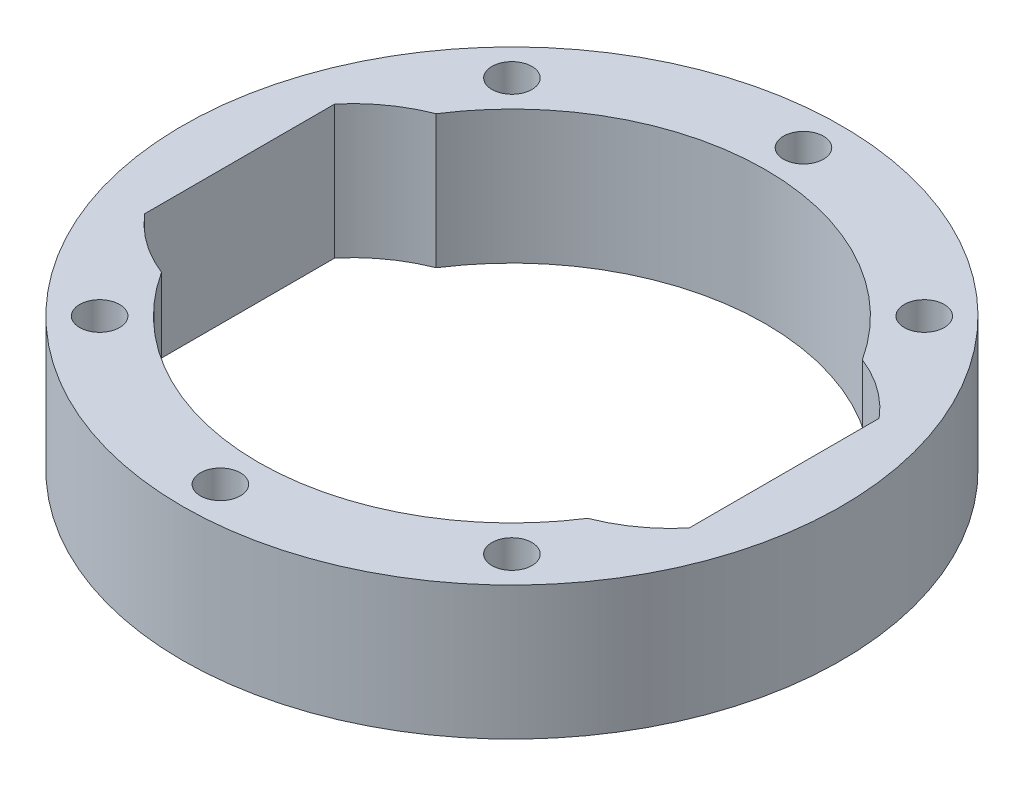
ISO-10303-21;
HEADER;
FILE_DESCRIPTION(('STEP AP214'),'2;1');
FILE_NAME('part.step','',(''),(''),'','','');
FILE_SCHEMA(('AUTOMOTIVE_DESIGN { 1 0 10303 214 1 1 1 1 }'));
ENDSEC;
DATA;
#1=APPLICATION_CONTEXT('core data for automotive mechanical design processes');
#2=APPLICATION_PROTOCOL_DEFINITION('international standard','automotive_design',2000,#1);
#3=PRODUCT_CONTEXT('',#1,'mechanical');
#4=PRODUCT('Part','Part','',(#3));
#5=PRODUCT_RELATED_PRODUCT_CATEGORY('part','',(#4));
#6=PRODUCT_DEFINITION_FORMATION('','',#4);
#7=PRODUCT_DEFINITION_CONTEXT('part definition',#1,'design');
#8=PRODUCT_DEFINITION('design','',#6,#7);
#9=PRODUCT_DEFINITION_SHAPE('','',#8);
#10=(LENGTH_UNIT() NAMED_UNIT(*) SI_UNIT(.MILLI.,.METRE.));
#11=(NAMED_UNIT(*) PLANE_ANGLE_UNIT() SI_UNIT($,.RADIAN.));
#12=(NAMED_UNIT(*) SI_UNIT($,.STERADIAN.) SOLID_ANGLE_UNIT());
#13=UNCERTAINTY_MEASURE_WITH_UNIT(LENGTH_MEASURE(1.E-05),#10,'distance_accuracy_value','');
#14=(GEOMETRIC_REPRESENTATION_CONTEXT(3) GLOBAL_UNCERTAINTY_ASSIGNED_CONTEXT((#13)) GLOBAL_UNIT_ASSIGNED_CONTEXT((#10,
#11,#12)) REPRESENTATION_CONTEXT('',''));
#15=CARTESIAN_POINT('',(0.,0.,0.));
#16=DIRECTION('',(0.,0.,1.));
#17=DIRECTION('',(1.,0.,0.));
#18=AXIS2_PLACEMENT_3D('',#15,#16,#17);
#19=CARTESIAN_POINT('',(0.,20.,0.));
#20=DIRECTION('',(0.,1.,0.));
#21=DIRECTION('',(0.,0.,1.));
#22=AXIS2_PLACEMENT_3D('',#19,#20,#21);
#23=PLANE('',#22);
#24=CARTESIAN_POINT('',(0.,20.,-43.7));
#25=DIRECTION('',(0.,1.,0.));
#26=DIRECTION('',(0.,0.,1.));
#27=AXIS2_PLACEMENT_3D('',#24,#25,#26);
#28=CIRCLE('',#27,3.);
#29=CARTESIAN_POINT('',(0.,20.,-40.7));
#30=VERTEX_POINT('',#29);
#31=EDGE_CURVE('E171',#30,#30,#28,.T.);
#32=ORIENTED_EDGE('',*,*,#31,.F.);
#33=EDGE_LOOP('',(#32));
#34=FACE_BOUND('',#33,.T.);
#35=CARTESIAN_POINT('',(-30.9005663378517,20.,-30.9005663378525));
#36=DIRECTION('',(0.,1.,0.));
#37=DIRECTION('',(0.,0.,1.));
#38=AXIS2_PLACEMENT_3D('',#35,#36,#37);
#39=CIRCLE('',#38,3.);
#40=CARTESIAN_POINT('',(-30.9005663378517,20.,-27.9005663378525));
#41=VERTEX_POINT('',#40);
#42=EDGE_CURVE('E370',#41,#41,#39,.T.);
#43=ORIENTED_EDGE('',*,*,#42,.F.);
#44=EDGE_LOOP('',(#43));
#45=FACE_BOUND('',#44,.T.);
#46=CARTESIAN_POINT('',(-30.9005663378524,20.,30.9005663378519));
#47=DIRECTION('',(0.,1.,0.));
#48=DIRECTION('',(0.,0.,1.));
#49=AXIS2_PLACEMENT_3D('',#46,#47,#48);
#50=CIRCLE('',#49,3.);
#51=CARTESIAN_POINT('',(-30.9005663378524,20.,33.9005663378519));
#52=VERTEX_POINT('',#51);
#53=EDGE_CURVE('E369',#52,#52,#50,.T.);
#54=ORIENTED_EDGE('',*,*,#53,.F.);
#55=EDGE_LOOP('',(#54));
#56=FACE_BOUND('',#55,.T.);
#57=CARTESIAN_POINT('',(-3.0515546901489E-13,20.,43.7));
#58=DIRECTION('',(0.,1.,0.));
#59=DIRECTION('',(0.,0.,1.));
#60=AXIS2_PLACEMENT_3D('',#57,#58,#59);
#61=CIRCLE('',#60,3.);
#62=CARTESIAN_POINT('',(-3.0515546901489E-13,20.,46.7));
#63=VERTEX_POINT('',#62);
#64=EDGE_CURVE('E384',#63,#63,#61,.T.);
#65=ORIENTED_EDGE('',*,*,#64,.F.);
#66=EDGE_LOOP('',(#65));
#67=FACE_BOUND('',#66,.T.);
#68=CARTESIAN_POINT('',(30.900566337852,20.,30.9005663378523));
#69=DIRECTION('',(0.,1.,0.));
#70=DIRECTION('',(0.,0.,1.));
#71=AXIS2_PLACEMENT_3D('',#68,#69,#70);
#72=CIRCLE('',#71,3.);
#73=CARTESIAN_POINT('',(30.900566337852,20.,33.9005663378523));
#74=VERTEX_POINT('',#73);
#75=EDGE_CURVE('E378',#74,#74,#72,.T.);
#76=ORIENTED_EDGE('',*,*,#75,.F.);
#77=EDGE_LOOP('',(#76));
#78=FACE_BOUND('',#77,.T.);
#79=CARTESIAN_POINT('',(30.9005663378522,20.,-30.9005663378521));
#80=DIRECTION('',(0.,1.,0.));
#81=DIRECTION('',(0.,0.,1.));
#82=AXIS2_PLACEMENT_3D('',#79,#80,#81);
#83=CIRCLE('',#82,3.);
#84=CARTESIAN_POINT('',(30.9005663378522,20.,-27.9005663378521));
#85=VERTEX_POINT('',#84);
#86=EDGE_CURVE('E363',#85,#85,#83,.T.);
#87=ORIENTED_EDGE('',*,*,#86,.F.);
#88=EDGE_LOOP('',(#87));
#89=FACE_BOUND('',#88,.T.);
#90=CARTESIAN_POINT('',(0.,20.,0.));
#91=DIRECTION('',(0.,1.,0.));
#92=DIRECTION('',(0.,0.,1.));
#93=AXIS2_PLACEMENT_3D('',#90,#91,#92);
#94=CIRCLE('',#93,49.4);
#95=CARTESIAN_POINT('',(0.,20.,49.4));
#96=VERTEX_POINT('',#95);
#97=EDGE_CURVE('E12',#96,#96,#94,.T.);
#98=ORIENTED_EDGE('',*,*,#97,.T.);
#99=EDGE_LOOP('',(#98));
#100=FACE_BOUND('',#99,.T.);
#101=CARTESIAN_POINT('',(-23.9,20.,0.));
#102=DIRECTION('',(0.,1.,0.));
#103=DIRECTION('',(0.,0.,1.));
#104=AXIS2_PLACEMENT_3D('',#101,#102,#103);
#105=CIRCLE('',#104,22.1);
#106=CARTESIAN_POINT('',(-31.9414225941423,20.,-20.5850800985184));
#107=VERTEX_POINT('',#106);
#108=CARTESIAN_POINT('',(-40.8,20.,-14.2407864951343));
#109=VERTEX_POINT('',#108);
#110=EDGE_CURVE('E144',#107,#109,#105,.T.);
#111=ORIENTED_EDGE('',*,*,#110,.F.);
#112=CARTESIAN_POINT('',(0.,20.,0.));
#113=DIRECTION('',(0.,1.,0.));
#114=DIRECTION('',(0.,0.,1.));
#115=AXIS2_PLACEMENT_3D('',#112,#113,#114);
#116=CIRCLE('',#115,38.);
#117=CARTESIAN_POINT('',(31.9414225941423,20.,-20.5850800985184));
#118=VERTEX_POINT('',#117);
#119=EDGE_CURVE('E136',#118,#107,#116,.T.);
#120=ORIENTED_EDGE('',*,*,#119,.F.);
#121=CARTESIAN_POINT('',(23.9,20.,0.));
#122=DIRECTION('',(0.,1.,0.));
#123=DIRECTION('',(0.,0.,1.));
#124=AXIS2_PLACEMENT_3D('',#121,#122,#123);
#125=CIRCLE('',#124,22.1);
#126=CARTESIAN_POINT('',(40.8,20.,-14.2407864951343));
#127=VERTEX_POINT('',#126);
#128=EDGE_CURVE('E168',#127,#118,#125,.T.);
#129=ORIENTED_EDGE('',*,*,#128,.F.);
#130=DIRECTION('',(0.,0.,1.));
#131=VECTOR('',#130,1.);
#132=CARTESIAN_POINT('',(40.8,20.,-14.2407864951343));
#133=LINE('',#132,#131);
#134=CARTESIAN_POINT('',(40.8,20.,14.2407864951343));
#135=VERTEX_POINT('',#134);
#136=EDGE_CURVE('E85',#127,#135,#133,.T.);
#137=ORIENTED_EDGE('',*,*,#136,.T.);
#138=CARTESIAN_POINT('',(23.9,20.,0.));
#139=DIRECTION('',(0.,1.,0.));
#140=DIRECTION('',(0.,0.,1.));
#141=AXIS2_PLACEMENT_3D('',#138,#139,#140);
#142=CIRCLE('',#141,22.1);
#143=CARTESIAN_POINT('',(31.9414225941423,20.,20.5850800985184));
#144=VERTEX_POINT('',#143);
#145=EDGE_CURVE('E165',#144,#135,#142,.T.);
#146=ORIENTED_EDGE('',*,*,#145,.F.);
#147=CARTESIAN_POINT('',(0.,20.,0.));
#148=DIRECTION('',(0.,1.,0.));
#149=DIRECTION('',(0.,0.,1.));
#150=AXIS2_PLACEMENT_3D('',#147,#148,#149);
#151=CIRCLE('',#150,38.);
#152=CARTESIAN_POINT('',(-31.9414225941423,20.,20.5850800985184));
#153=VERTEX_POINT('',#152);
#154=EDGE_CURVE('E163',#153,#144,#151,.T.);
#155=ORIENTED_EDGE('',*,*,#154,.F.);
#156=CARTESIAN_POINT('',(-23.9,20.,0.));
#157=DIRECTION('',(0.,1.,0.));
#158=DIRECTION('',(0.,0.,1.));
#159=AXIS2_PLACEMENT_3D('',#156,#157,#158);
#160=CIRCLE('',#159,22.1);
#161=CARTESIAN_POINT('',(-40.8,20.,14.2407864951343));
#162=VERTEX_POINT('',#161);
#163=EDGE_CURVE('E158',#162,#153,#160,.T.);
#164=ORIENTED_EDGE('',*,*,#163,.F.);
#165=DIRECTION('',(0.,0.,1.));
#166=VECTOR('',#165,1.);
#167=CARTESIAN_POINT('',(-40.8,20.,-14.2407864951343));
#168=LINE('',#167,#166);
#169=EDGE_CURVE('E156',#109,#162,#168,.T.);
#170=ORIENTED_EDGE('',*,*,#169,.F.);
#171=EDGE_LOOP('',(#111,#120,#129,#137,#146,#155,#164,#170));
#172=FACE_BOUND('',#171,.T.);
#173=ADVANCED_FACE('F70',(#34,#45,#56,#67,#78,#89,#100,#172),#23,.T.);
#174=CARTESIAN_POINT('',(0.,0.,0.));
#175=DIRECTION('',(0.,1.,0.));
#176=DIRECTION('',(0.,0.,1.));
#177=AXIS2_PLACEMENT_3D('',#174,#175,#176);
#178=PLANE('',#177);
#179=CARTESIAN_POINT('',(0.,0.,-43.7));
#180=DIRECTION('',(0.,1.,0.));
#181=DIRECTION('',(0.,0.,1.));
#182=AXIS2_PLACEMENT_3D('',#179,#180,#181);
#183=CIRCLE('',#182,3.);
#184=CARTESIAN_POINT('',(0.,0.,-40.7));
#185=VERTEX_POINT('',#184);
#186=EDGE_CURVE('E358',#185,#185,#183,.T.);
#187=ORIENTED_EDGE('',*,*,#186,.T.);
#188=EDGE_LOOP('',(#187));
#189=FACE_BOUND('',#188,.T.);
#190=CARTESIAN_POINT('',(-30.9005663378517,0.,-30.9005663378525));
#191=DIRECTION('',(0.,1.,0.));
#192=DIRECTION('',(0.,0.,1.));
#193=AXIS2_PLACEMENT_3D('',#190,#191,#192);
#194=CIRCLE('',#193,3.);
#195=CARTESIAN_POINT('',(-30.9005663378517,0.,-27.9005663378525));
#196=VERTEX_POINT('',#195);
#197=EDGE_CURVE('E366',#196,#196,#194,.T.);
#198=ORIENTED_EDGE('',*,*,#197,.T.);
#199=EDGE_LOOP('',(#198));
#200=FACE_BOUND('',#199,.T.);
#201=CARTESIAN_POINT('',(-30.9005663378524,0.,30.9005663378519));
#202=DIRECTION('',(0.,1.,0.));
#203=DIRECTION('',(0.,0.,1.));
#204=AXIS2_PLACEMENT_3D('',#201,#202,#203);
#205=CIRCLE('',#204,3.);
#206=CARTESIAN_POINT('',(-30.9005663378524,0.,33.9005663378519));
#207=VERTEX_POINT('',#206);
#208=EDGE_CURVE('E387',#207,#207,#205,.T.);
#209=ORIENTED_EDGE('',*,*,#208,.T.);
#210=EDGE_LOOP('',(#209));
#211=FACE_BOUND('',#210,.T.);
#212=CARTESIAN_POINT('',(-3.0515546901489E-13,0.,43.7));
#213=DIRECTION('',(0.,1.,0.));
#214=DIRECTION('',(0.,0.,1.));
#215=AXIS2_PLACEMENT_3D('',#212,#213,#214);
#216=CIRCLE('',#215,3.);
#217=CARTESIAN_POINT('',(-3.0515546901489E-13,0.,46.7));
#218=VERTEX_POINT('',#217);
#219=EDGE_CURVE('E381',#218,#218,#216,.T.);
#220=ORIENTED_EDGE('',*,*,#219,.T.);
#221=EDGE_LOOP('',(#220));
#222=FACE_BOUND('',#221,.T.);
#223=CARTESIAN_POINT('',(30.900566337852,0.,30.9005663378523));
#224=DIRECTION('',(0.,1.,0.));
#225=DIRECTION('',(0.,0.,1.));
#226=AXIS2_PLACEMENT_3D('',#223,#224,#225);
#227=CIRCLE('',#226,3.);
#228=CARTESIAN_POINT('',(30.900566337852,0.,33.9005663378523));
#229=VERTEX_POINT('',#228);
#230=EDGE_CURVE('E375',#229,#229,#227,.T.);
#231=ORIENTED_EDGE('',*,*,#230,.T.);
#232=EDGE_LOOP('',(#231));
#233=FACE_BOUND('',#232,.T.);
#234=CARTESIAN_POINT('',(30.9005663378522,0.,-30.9005663378521));
#235=DIRECTION('',(0.,1.,0.));
#236=DIRECTION('',(0.,0.,1.));
#237=AXIS2_PLACEMENT_3D('',#234,#235,#236);
#238=CIRCLE('',#237,3.);
#239=CARTESIAN_POINT('',(30.9005663378522,0.,-27.9005663378521));
#240=VERTEX_POINT('',#239);
#241=EDGE_CURVE('E359',#240,#240,#238,.T.);
#242=ORIENTED_EDGE('',*,*,#241,.T.);
#243=EDGE_LOOP('',(#242));
#244=FACE_BOUND('',#243,.T.);
#245=CARTESIAN_POINT('',(0.,0.,0.));
#246=DIRECTION('',(0.,1.,0.));
#247=DIRECTION('',(0.,0.,1.));
#248=AXIS2_PLACEMENT_3D('',#245,#246,#247);
#249=CIRCLE('',#248,49.4);
#250=CARTESIAN_POINT('',(0.,0.,49.4));
#251=VERTEX_POINT('',#250);
#252=EDGE_CURVE('E74',#251,#251,#249,.T.);
#253=ORIENTED_EDGE('',*,*,#252,.F.);
#254=EDGE_LOOP('',(#253));
#255=FACE_BOUND('',#254,.T.);
#256=CARTESIAN_POINT('',(0.,0.,0.));
#257=DIRECTION('',(0.,1.,0.));
#258=DIRECTION('',(0.,0.,1.));
#259=AXIS2_PLACEMENT_3D('',#256,#257,#258);
#260=CIRCLE('',#259,38.);
#261=CARTESIAN_POINT('',(31.9414225941423,0.,-20.5850800985184));
#262=VERTEX_POINT('',#261);
#263=CARTESIAN_POINT('',(-31.9414225941423,0.,-20.5850800985184));
#264=VERTEX_POINT('',#263);
#265=EDGE_CURVE('E93',#262,#264,#260,.T.);
#266=ORIENTED_EDGE('',*,*,#265,.T.);
#267=CARTESIAN_POINT('',(-23.9,0.,0.));
#268=DIRECTION('',(0.,1.,0.));
#269=DIRECTION('',(0.,0.,1.));
#270=AXIS2_PLACEMENT_3D('',#267,#268,#269);
#271=CIRCLE('',#270,22.1);
#272=CARTESIAN_POINT('',(-40.8,0.,-14.2407864951343));
#273=VERTEX_POINT('',#272);
#274=EDGE_CURVE('E151',#264,#273,#271,.T.);
#275=ORIENTED_EDGE('',*,*,#274,.T.);
#276=DIRECTION('',(0.,0.,1.));
#277=VECTOR('',#276,1.);
#278=CARTESIAN_POINT('',(-40.8,0.,-14.2407864951343));
#279=LINE('',#278,#277);
#280=CARTESIAN_POINT('',(-40.8,0.,14.2407864951343));
#281=VERTEX_POINT('',#280);
#282=EDGE_CURVE('E173',#273,#281,#279,.T.);
#283=ORIENTED_EDGE('',*,*,#282,.T.);
#284=CARTESIAN_POINT('',(-23.9,0.,0.));
#285=DIRECTION('',(0.,1.,0.));
#286=DIRECTION('',(0.,0.,1.));
#287=AXIS2_PLACEMENT_3D('',#284,#285,#286);
#288=CIRCLE('',#287,22.1);
#289=CARTESIAN_POINT('',(-31.9414225941423,0.,20.5850800985184));
#290=VERTEX_POINT('',#289);
#291=EDGE_CURVE('E176',#281,#290,#288,.T.);
#292=ORIENTED_EDGE('',*,*,#291,.T.);
#293=CARTESIAN_POINT('',(0.,0.,0.));
#294=DIRECTION('',(0.,1.,0.));
#295=DIRECTION('',(0.,0.,1.));
#296=AXIS2_PLACEMENT_3D('',#293,#294,#295);
#297=CIRCLE('',#296,38.);
#298=CARTESIAN_POINT('',(31.9414225941423,0.,20.5850800985184));
#299=VERTEX_POINT('',#298);
#300=EDGE_CURVE('E179',#290,#299,#297,.T.);
#301=ORIENTED_EDGE('',*,*,#300,.T.);
#302=CARTESIAN_POINT('',(23.9,0.,0.));
#303=DIRECTION('',(0.,1.,0.));
#304=DIRECTION('',(0.,0.,1.));
#305=AXIS2_PLACEMENT_3D('',#302,#303,#304);
#306=CIRCLE('',#305,22.1);
#307=CARTESIAN_POINT('',(40.8,0.,14.2407864951343));
#308=VERTEX_POINT('',#307);
#309=EDGE_CURVE('E182',#299,#308,#306,.T.);
#310=ORIENTED_EDGE('',*,*,#309,.T.);
#311=DIRECTION('',(0.,0.,1.));
#312=VECTOR('',#311,1.);
#313=CARTESIAN_POINT('',(40.8,0.,-14.2407864951343));
#314=LINE('',#313,#312);
#315=CARTESIAN_POINT('',(40.8,0.,-14.2407864951343));
#316=VERTEX_POINT('',#315);
#317=EDGE_CURVE('E185',#316,#308,#314,.T.);
#318=ORIENTED_EDGE('',*,*,#317,.F.);
#319=CARTESIAN_POINT('',(23.9,0.,0.));
#320=DIRECTION('',(0.,1.,0.));
#321=DIRECTION('',(0.,0.,1.));
#322=AXIS2_PLACEMENT_3D('',#319,#320,#321);
#323=CIRCLE('',#322,22.1);
#324=EDGE_CURVE('E145',#316,#262,#323,.T.);
#325=ORIENTED_EDGE('',*,*,#324,.T.);
#326=EDGE_LOOP('',(#266,#275,#283,#292,#301,#310,#318,#325));
#327=FACE_BOUND('',#326,.T.);
#328=ADVANCED_FACE('F207',(#189,#200,#211,#222,#233,#244,#255,#327),#178,.F.);
#329=CARTESIAN_POINT('',(0.,20.,0.));
#330=DIRECTION('',(0.,-1.,0.));
#331=DIRECTION('',(0.,0.,-1.));
#332=AXIS2_PLACEMENT_3D('',#329,#330,#331);
#333=CYLINDRICAL_SURFACE('',#332,49.4);
#334=ORIENTED_EDGE('',*,*,#97,.F.);
#335=EDGE_LOOP('',(#334));
#336=FACE_BOUND('',#335,.T.);
#337=ORIENTED_EDGE('',*,*,#252,.T.);
#338=EDGE_LOOP('',(#337));
#339=FACE_BOUND('',#338,.T.);
#340=ADVANCED_FACE('F72',(#336,#339),#333,.T.);
#341=CARTESIAN_POINT('',(0.,20.,0.));
#342=DIRECTION('',(0.,-1.,0.));
#343=DIRECTION('',(0.,0.,-1.));
#344=AXIS2_PLACEMENT_3D('',#341,#342,#343);
#345=CYLINDRICAL_SURFACE('',#344,38.);
#346=ORIENTED_EDGE('',*,*,#265,.F.);
#347=DIRECTION('',(0.,-1.,0.));
#348=VECTOR('',#347,1.);
#349=CARTESIAN_POINT('',(31.9414225941423,20.,-20.5850800985184));
#350=LINE('',#349,#348);
#351=EDGE_CURVE('E140',#118,#262,#350,.T.);
#352=ORIENTED_EDGE('',*,*,#351,.F.);
#353=ORIENTED_EDGE('',*,*,#119,.T.);
#354=DIRECTION('',(0.,-1.,0.));
#355=VECTOR('',#354,1.);
#356=CARTESIAN_POINT('',(-31.9414225941423,20.,-20.5850800985184));
#357=LINE('',#356,#355);
#358=EDGE_CURVE('E139',#107,#264,#357,.T.);
#359=ORIENTED_EDGE('',*,*,#358,.T.);
#360=EDGE_LOOP('',(#346,#352,#353,#359));
#361=FACE_BOUND('',#360,.T.);
#362=ADVANCED_FACE('F138',(#361),#345,.F.);
#363=CARTESIAN_POINT('',(-23.9,20.,0.));
#364=DIRECTION('',(0.,-1.,0.));
#365=DIRECTION('',(0.,0.,-1.));
#366=AXIS2_PLACEMENT_3D('',#363,#364,#365);
#367=CYLINDRICAL_SURFACE('',#366,22.1);
#368=ORIENTED_EDGE('',*,*,#274,.F.);
#369=ORIENTED_EDGE('',*,*,#358,.F.);
#370=ORIENTED_EDGE('',*,*,#110,.T.);
#371=DIRECTION('',(0.,-1.,0.));
#372=VECTOR('',#371,1.);
#373=CARTESIAN_POINT('',(-40.8,20.,-14.2407864951343));
#374=LINE('',#373,#372);
#375=EDGE_CURVE('E152',#109,#273,#374,.T.);
#376=ORIENTED_EDGE('',*,*,#375,.T.);
#377=EDGE_LOOP('',(#368,#369,#370,#376));
#378=FACE_BOUND('',#377,.T.);
#379=ADVANCED_FACE('F148',(#378),#367,.F.);
#380=CARTESIAN_POINT('',(-40.8,20.,-14.2407864951343));
#381=DIRECTION('',(1.,0.,0.));
#382=DIRECTION('',(0.,0.,-1.));
#383=AXIS2_PLACEMENT_3D('',#380,#381,#382);
#384=PLANE('',#383);
#385=ORIENTED_EDGE('',*,*,#282,.F.);
#386=ORIENTED_EDGE('',*,*,#375,.F.);
#387=ORIENTED_EDGE('',*,*,#169,.T.);
#388=DIRECTION('',(0.,-1.,0.));
#389=VECTOR('',#388,1.);
#390=CARTESIAN_POINT('',(-40.8,20.,14.2407864951343));
#391=LINE('',#390,#389);
#392=EDGE_CURVE('E199',#162,#281,#391,.T.);
#393=ORIENTED_EDGE('',*,*,#392,.T.);
#394=EDGE_LOOP('',(#385,#386,#387,#393));
#395=FACE_BOUND('',#394,.T.);
#396=ADVANCED_FACE('F203',(#395),#384,.T.);
#397=CARTESIAN_POINT('',(-23.9,20.,0.));
#398=DIRECTION('',(0.,-1.,0.));
#399=DIRECTION('',(0.,0.,-1.));
#400=AXIS2_PLACEMENT_3D('',#397,#398,#399);
#401=CYLINDRICAL_SURFACE('',#400,22.1);
#402=ORIENTED_EDGE('',*,*,#291,.F.);
#403=ORIENTED_EDGE('',*,*,#392,.F.);
#404=ORIENTED_EDGE('',*,*,#163,.T.);
#405=DIRECTION('',(0.,-1.,0.));
#406=VECTOR('',#405,1.);
#407=CARTESIAN_POINT('',(-31.9414225941423,20.,20.5850800985184));
#408=LINE('',#407,#406);
#409=EDGE_CURVE('E197',#153,#290,#408,.T.);
#410=ORIENTED_EDGE('',*,*,#409,.T.);
#411=EDGE_LOOP('',(#402,#403,#404,#410));
#412=FACE_BOUND('',#411,.T.);
#413=ADVANCED_FACE('F224',(#412),#401,.F.);
#414=CARTESIAN_POINT('',(0.,20.,0.));
#415=DIRECTION('',(0.,-1.,0.));
#416=DIRECTION('',(0.,0.,-1.));
#417=AXIS2_PLACEMENT_3D('',#414,#415,#416);
#418=CYLINDRICAL_SURFACE('',#417,38.);
#419=ORIENTED_EDGE('',*,*,#300,.F.);
#420=ORIENTED_EDGE('',*,*,#409,.F.);
#421=ORIENTED_EDGE('',*,*,#154,.T.);
#422=DIRECTION('',(0.,-1.,0.));
#423=VECTOR('',#422,1.);
#424=CARTESIAN_POINT('',(31.9414225941423,20.,20.5850800985184));
#425=LINE('',#424,#423);
#426=EDGE_CURVE('E195',#144,#299,#425,.T.);
#427=ORIENTED_EDGE('',*,*,#426,.T.);
#428=EDGE_LOOP('',(#419,#420,#421,#427));
#429=FACE_BOUND('',#428,.T.);
#430=ADVANCED_FACE('F222',(#429),#418,.F.);
#431=CARTESIAN_POINT('',(23.9,20.,0.));
#432=DIRECTION('',(0.,-1.,0.));
#433=DIRECTION('',(0.,0.,-1.));
#434=AXIS2_PLACEMENT_3D('',#431,#432,#433);
#435=CYLINDRICAL_SURFACE('',#434,22.1);
#436=ORIENTED_EDGE('',*,*,#309,.F.);
#437=ORIENTED_EDGE('',*,*,#426,.F.);
#438=ORIENTED_EDGE('',*,*,#145,.T.);
#439=DIRECTION('',(0.,-1.,0.));
#440=VECTOR('',#439,1.);
#441=CARTESIAN_POINT('',(40.8,20.,14.2407864951343));
#442=LINE('',#441,#440);
#443=EDGE_CURVE('E193',#135,#308,#442,.T.);
#444=ORIENTED_EDGE('',*,*,#443,.T.);
#445=EDGE_LOOP('',(#436,#437,#438,#444));
#446=FACE_BOUND('',#445,.T.);
#447=ADVANCED_FACE('F217',(#446),#435,.F.);
#448=CARTESIAN_POINT('',(40.8,20.,-14.2407864951343));
#449=DIRECTION('',(1.,0.,0.));
#450=DIRECTION('',(0.,0.,-1.));
#451=AXIS2_PLACEMENT_3D('',#448,#449,#450);
#452=PLANE('',#451);
#453=ORIENTED_EDGE('',*,*,#317,.T.);
#454=ORIENTED_EDGE('',*,*,#443,.F.);
#455=ORIENTED_EDGE('',*,*,#136,.F.);
#456=DIRECTION('',(0.,-1.,0.));
#457=VECTOR('',#456,1.);
#458=CARTESIAN_POINT('',(40.8,20.,-14.2407864951343));
#459=LINE('',#458,#457);
#460=EDGE_CURVE('E191',#127,#316,#459,.T.);
#461=ORIENTED_EDGE('',*,*,#460,.T.);
#462=EDGE_LOOP('',(#453,#454,#455,#461));
#463=FACE_BOUND('',#462,.T.);
#464=ADVANCED_FACE('F218',(#463),#452,.F.);
#465=CARTESIAN_POINT('',(23.9,20.,0.));
#466=DIRECTION('',(0.,-1.,0.));
#467=DIRECTION('',(0.,0.,-1.));
#468=AXIS2_PLACEMENT_3D('',#465,#466,#467);
#469=CYLINDRICAL_SURFACE('',#468,22.1);
#470=ORIENTED_EDGE('',*,*,#324,.F.);
#471=ORIENTED_EDGE('',*,*,#460,.F.);
#472=ORIENTED_EDGE('',*,*,#128,.T.);
#473=ORIENTED_EDGE('',*,*,#351,.T.);
#474=EDGE_LOOP('',(#470,#471,#472,#473));
#475=FACE_BOUND('',#474,.T.);
#476=ADVANCED_FACE('F211',(#475),#469,.F.);
#477=CARTESIAN_POINT('',(30.9005663378522,20.,-30.9005663378521));
#478=DIRECTION('',(0.,-1.,0.));
#479=DIRECTION('',(0.,0.,-1.));
#480=AXIS2_PLACEMENT_3D('',#477,#478,#479);
#481=CYLINDRICAL_SURFACE('',#480,3.);
#482=ORIENTED_EDGE('',*,*,#86,.T.);
#483=EDGE_LOOP('',(#482));
#484=FACE_BOUND('',#483,.T.);
#485=ORIENTED_EDGE('',*,*,#241,.F.);
#486=EDGE_LOOP('',(#485));
#487=FACE_BOUND('',#486,.T.);
#488=ADVANCED_FACE('F292',(#484,#487),#481,.F.);
#489=CARTESIAN_POINT('',(30.900566337852,20.,30.9005663378523));
#490=DIRECTION('',(0.,-1.,0.));
#491=DIRECTION('',(0.,0.,-1.));
#492=AXIS2_PLACEMENT_3D('',#489,#490,#491);
#493=CYLINDRICAL_SURFACE('',#492,3.);
#494=ORIENTED_EDGE('',*,*,#75,.T.);
#495=EDGE_LOOP('',(#494));
#496=FACE_BOUND('',#495,.T.);
#497=ORIENTED_EDGE('',*,*,#230,.F.);
#498=EDGE_LOOP('',(#497));
#499=FACE_BOUND('',#498,.T.);
#500=ADVANCED_FACE('F301',(#496,#499),#493,.F.);
#501=CARTESIAN_POINT('',(-3.0515546901489E-13,20.,43.7));
#502=DIRECTION('',(0.,-1.,0.));
#503=DIRECTION('',(0.,0.,-1.));
#504=AXIS2_PLACEMENT_3D('',#501,#502,#503);
#505=CYLINDRICAL_SURFACE('',#504,3.);
#506=ORIENTED_EDGE('',*,*,#64,.T.);
#507=EDGE_LOOP('',(#506));
#508=FACE_BOUND('',#507,.T.);
#509=ORIENTED_EDGE('',*,*,#219,.F.);
#510=EDGE_LOOP('',(#509));
#511=FACE_BOUND('',#510,.T.);
#512=ADVANCED_FACE('F311',(#508,#511),#505,.F.);
#513=CARTESIAN_POINT('',(-30.9005663378524,20.,30.9005663378519));
#514=DIRECTION('',(0.,-1.,0.));
#515=DIRECTION('',(0.,0.,-1.));
#516=AXIS2_PLACEMENT_3D('',#513,#514,#515);
#517=CYLINDRICAL_SURFACE('',#516,3.);
#518=ORIENTED_EDGE('',*,*,#53,.T.);
#519=EDGE_LOOP('',(#518));
#520=FACE_BOUND('',#519,.T.);
#521=ORIENTED_EDGE('',*,*,#208,.F.);
#522=EDGE_LOOP('',(#521));
#523=FACE_BOUND('',#522,.T.);
#524=ADVANCED_FACE('F321',(#520,#523),#517,.F.);
#525=CARTESIAN_POINT('',(-30.9005663378517,20.,-30.9005663378525));
#526=DIRECTION('',(0.,-1.,0.));
#527=DIRECTION('',(0.,0.,-1.));
#528=AXIS2_PLACEMENT_3D('',#525,#526,#527);
#529=CYLINDRICAL_SURFACE('',#528,3.);
#530=ORIENTED_EDGE('',*,*,#42,.T.);
#531=EDGE_LOOP('',(#530));
#532=FACE_BOUND('',#531,.T.);
#533=ORIENTED_EDGE('',*,*,#197,.F.);
#534=EDGE_LOOP('',(#533));
#535=FACE_BOUND('',#534,.T.);
#536=ADVANCED_FACE('F331',(#532,#535),#529,.F.);
#537=CARTESIAN_POINT('',(0.,20.,-43.7));
#538=DIRECTION('',(0.,-1.,0.));
#539=DIRECTION('',(0.,0.,-1.));
#540=AXIS2_PLACEMENT_3D('',#537,#538,#539);
#541=CYLINDRICAL_SURFACE('',#540,3.);
#542=ORIENTED_EDGE('',*,*,#31,.T.);
#543=EDGE_LOOP('',(#542));
#544=FACE_BOUND('',#543,.T.);
#545=ORIENTED_EDGE('',*,*,#186,.F.);
#546=EDGE_LOOP('',(#545));
#547=FACE_BOUND('',#546,.T.);
#548=ADVANCED_FACE('F341',(#544,#547),#541,.F.);
#549=CLOSED_SHELL('',(#173,#328,#340,#362,#379,#396,#413,#430,#447,#464,#476,#488,#500,#512,
#524,#536,#548));
#550=MANIFOLD_SOLID_BREP('B2',#549);
#551=ADVANCED_BREP_SHAPE_REPRESENTATION('',(#18,#550),#14);
#552=SHAPE_DEFINITION_REPRESENTATION(#9,#551);
ENDSEC;
END-ISO-10303-21;
